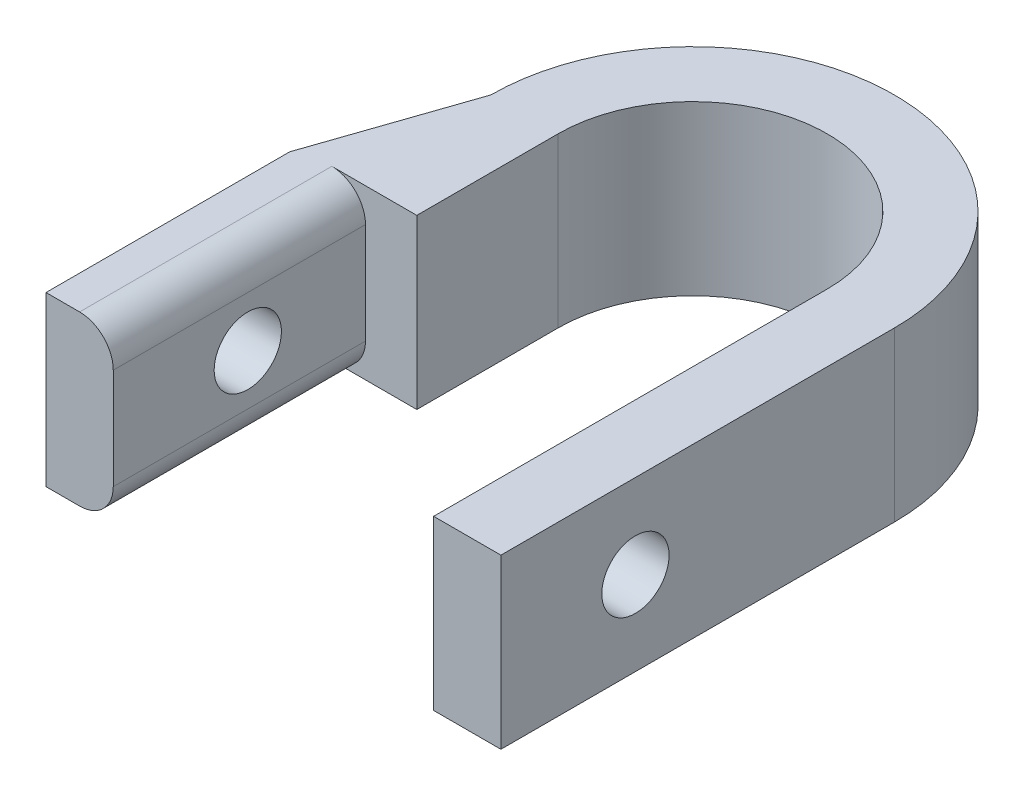
ISO-10303-21;
HEADER;
FILE_DESCRIPTION(('STEP AP214'),'2;1');
FILE_NAME('part.step','',(''),(''),'','','');
FILE_SCHEMA(('AUTOMOTIVE_DESIGN { 1 0 10303 214 1 1 1 1 }'));
ENDSEC;
DATA;
#1=APPLICATION_CONTEXT('core data for automotive mechanical design processes');
#2=APPLICATION_PROTOCOL_DEFINITION('international standard','automotive_design',2000,#1);
#3=PRODUCT_CONTEXT('',#1,'mechanical');
#4=PRODUCT('Part','Part','',(#3));
#5=PRODUCT_RELATED_PRODUCT_CATEGORY('part','',(#4));
#6=PRODUCT_DEFINITION_FORMATION('','',#4);
#7=PRODUCT_DEFINITION_CONTEXT('part definition',#1,'design');
#8=PRODUCT_DEFINITION('design','',#6,#7);
#9=PRODUCT_DEFINITION_SHAPE('','',#8);
#10=(LENGTH_UNIT() NAMED_UNIT(*) SI_UNIT(.MILLI.,.METRE.));
#11=(NAMED_UNIT(*) PLANE_ANGLE_UNIT() SI_UNIT($,.RADIAN.));
#12=(NAMED_UNIT(*) SI_UNIT($,.STERADIAN.) SOLID_ANGLE_UNIT());
#13=UNCERTAINTY_MEASURE_WITH_UNIT(LENGTH_MEASURE(1.E-05),#10,'distance_accuracy_value','');
#14=(GEOMETRIC_REPRESENTATION_CONTEXT(3) GLOBAL_UNCERTAINTY_ASSIGNED_CONTEXT((#13)) GLOBAL_UNIT_ASSIGNED_CONTEXT((#10,
#11,#12)) REPRESENTATION_CONTEXT('',''));
#15=CARTESIAN_POINT('',(0.,0.,0.));
#16=DIRECTION('',(0.,0.,1.));
#17=DIRECTION('',(1.,0.,0.));
#18=AXIS2_PLACEMENT_3D('',#15,#16,#17);
#19=CARTESIAN_POINT('',(-17.5455309593657,15.875,13.3449942704179));
#20=DIRECTION('',(0.,0.,-1.));
#21=DIRECTION('',(-1.,0.,0.));
#22=AXIS2_PLACEMENT_3D('',#19,#20,#21);
#23=PLANE('',#22);
#24=DIRECTION('',(1.,0.,0.));
#25=VECTOR('',#24,1.);
#26=CARTESIAN_POINT('',(-17.5455309593657,0.,13.3449942704179));
#27=LINE('',#26,#25);
#28=CARTESIAN_POINT('',(-20.7205309593657,0.,13.3449942704179));
#29=VERTEX_POINT('',#28);
#30=CARTESIAN_POINT('',(-12.6998630978574,0.,13.3449942704179));
#31=VERTEX_POINT('',#30);
#32=EDGE_CURVE('E32',#29,#31,#27,.T.);
#33=ORIENTED_EDGE('',*,*,#32,.T.);
#34=DIRECTION('',(0.,-1.,0.));
#35=VECTOR('',#34,1.);
#36=CARTESIAN_POINT('',(-12.6998630978574,15.875,13.3449942704179));
#37=LINE('',#36,#35);
#38=CARTESIAN_POINT('',(-12.6998630978574,15.875,13.3449942704179));
#39=VERTEX_POINT('',#38);
#40=EDGE_CURVE('E123',#39,#31,#37,.T.);
#41=ORIENTED_EDGE('',*,*,#40,.F.);
#42=DIRECTION('',(1.,0.,0.));
#43=VECTOR('',#42,1.);
#44=CARTESIAN_POINT('',(-17.5455309593657,15.875,13.3449942704179));
#45=LINE('',#44,#43);
#46=CARTESIAN_POINT('',(-20.7205309593657,15.875,13.3449942704179));
#47=VERTEX_POINT('',#46);
#48=EDGE_CURVE('E109',#47,#39,#45,.T.);
#49=ORIENTED_EDGE('',*,*,#48,.F.);
#50=CARTESIAN_POINT('',(-20.7205309593657,12.7,13.3449942704179));
#51=DIRECTION('',(0.,0.,-1.));
#52=DIRECTION('',(-1.,0.,0.));
#53=AXIS2_PLACEMENT_3D('',#50,#51,#52);
#54=CIRCLE('',#53,3.175);
#55=CARTESIAN_POINT('',(-17.5455309593657,12.7,13.3449942704179));
#56=VERTEX_POINT('',#55);
#57=EDGE_CURVE('E25',#47,#56,#54,.T.);
#58=ORIENTED_EDGE('',*,*,#57,.T.);
#59=DIRECTION('',(0.,-1.,0.));
#60=VECTOR('',#59,1.);
#61=CARTESIAN_POINT('',(-17.5455309593657,15.875,13.3449942704179));
#62=LINE('',#61,#60);
#63=CARTESIAN_POINT('',(-17.5455309593657,3.175,13.3449942704179));
#64=VERTEX_POINT('',#63);
#65=EDGE_CURVE('E125',#56,#64,#62,.T.);
#66=ORIENTED_EDGE('',*,*,#65,.T.);
#67=CARTESIAN_POINT('',(-20.7205309593657,3.175,13.3449942704179));
#68=DIRECTION('',(0.,0.,-1.));
#69=DIRECTION('',(-1.,0.,0.));
#70=AXIS2_PLACEMENT_3D('',#67,#68,#69);
#71=CIRCLE('',#70,3.175);
#72=EDGE_CURVE('E11',#64,#29,#71,.T.);
#73=ORIENTED_EDGE('',*,*,#72,.T.);
#74=EDGE_LOOP('',(#33,#41,#49,#58,#66,#73));
#75=FACE_BOUND('',#74,.T.);
#76=ADVANCED_FACE('F17',(#75),#23,.F.);
#77=CARTESIAN_POINT('',(-12.6998630978574,15.875,13.3449942704179));
#78=DIRECTION('',(-0.99999999994738,0.,1.02586887505242E-05));
#79=DIRECTION('',(1.02586887505242E-05,0.,0.99999999994738));
#80=AXIS2_PLACEMENT_3D('',#77,#78,#79);
#81=PLANE('',#80);
#82=DIRECTION('',(-1.02586887505242E-05,0.,-0.99999999994738));
#83=VECTOR('',#82,1.);
#84=CARTESIAN_POINT('',(-12.6998630978574,0.,13.3449942704179));
#85=LINE('',#84,#83);
#86=CARTESIAN_POINT('',(-12.7,0.,0.));
#87=VERTEX_POINT('',#86);
#88=EDGE_CURVE('E152',#31,#87,#85,.T.);
#89=ORIENTED_EDGE('',*,*,#88,.T.);
#90=DIRECTION('',(0.,-1.,0.));
#91=VECTOR('',#90,1.);
#92=CARTESIAN_POINT('',(-12.7,15.875,0.));
#93=LINE('',#92,#91);
#94=CARTESIAN_POINT('',(-12.7,15.875,0.));
#95=VERTEX_POINT('',#94);
#96=EDGE_CURVE('E126',#95,#87,#93,.T.);
#97=ORIENTED_EDGE('',*,*,#96,.F.);
#98=DIRECTION('',(-1.02586887505242E-05,0.,-0.99999999994738));
#99=VECTOR('',#98,1.);
#100=CARTESIAN_POINT('',(-12.6998630978574,15.875,13.3449942704179));
#101=LINE('',#100,#99);
#102=EDGE_CURVE('E114',#39,#95,#101,.T.);
#103=ORIENTED_EDGE('',*,*,#102,.F.);
#104=ORIENTED_EDGE('',*,*,#40,.T.);
#105=EDGE_LOOP('',(#89,#97,#103,#104));
#106=FACE_BOUND('',#105,.T.);
#107=ADVANCED_FACE('F128',(#106),#81,.F.);
#108=CARTESIAN_POINT('',(0.,15.875,0.));
#109=DIRECTION('',(0.,-1.,0.));
#110=DIRECTION('',(0.,0.,-1.));
#111=AXIS2_PLACEMENT_3D('',#108,#109,#110);
#112=CYLINDRICAL_SURFACE('',#111,12.7);
#113=CARTESIAN_POINT('',(0.,0.,0.));
#114=DIRECTION('',(0.,-1.,0.));
#115=DIRECTION('',(0.,0.,1.));
#116=AXIS2_PLACEMENT_3D('',#113,#114,#115);
#117=CIRCLE('',#116,12.7);
#118=CARTESIAN_POINT('',(12.7,0.,0.));
#119=VERTEX_POINT('',#118);
#120=EDGE_CURVE('E155',#87,#119,#117,.T.);
#121=ORIENTED_EDGE('',*,*,#120,.T.);
#122=DIRECTION('',(0.,-1.,0.));
#123=VECTOR('',#122,1.);
#124=CARTESIAN_POINT('',(12.7,15.875,0.));
#125=LINE('',#124,#123);
#126=CARTESIAN_POINT('',(12.7,15.875,0.));
#127=VERTEX_POINT('',#126);
#128=EDGE_CURVE('E191',#127,#119,#125,.T.);
#129=ORIENTED_EDGE('',*,*,#128,.F.);
#130=CARTESIAN_POINT('',(0.,15.875,0.));
#131=DIRECTION('',(0.,-1.,0.));
#132=DIRECTION('',(0.,0.,1.));
#133=AXIS2_PLACEMENT_3D('',#130,#131,#132);
#134=CIRCLE('',#133,12.7);
#135=EDGE_CURVE('E131',#95,#127,#134,.T.);
#136=ORIENTED_EDGE('',*,*,#135,.F.);
#137=ORIENTED_EDGE('',*,*,#96,.T.);
#138=EDGE_LOOP('',(#121,#129,#136,#137));
#139=FACE_BOUND('',#138,.T.);
#140=ADVANCED_FACE('F246',(#139),#112,.F.);
#141=CARTESIAN_POINT('',(12.7,15.875,0.));
#142=DIRECTION('',(1.,0.,0.));
#143=DIRECTION('',(0.,0.,-1.));
#144=AXIS2_PLACEMENT_3D('',#141,#142,#143);
#145=PLANE('',#144);
#146=CARTESIAN_POINT('',(12.7,7.9375,24.4549942704179));
#147=DIRECTION('',(1.,0.,0.));
#148=DIRECTION('',(0.,0.,-1.));
#149=AXIS2_PLACEMENT_3D('',#146,#147,#148);
#150=CIRCLE('',#149,3.175);
#151=CARTESIAN_POINT('',(12.7,7.9375,21.2799942704179));
#152=VERTEX_POINT('',#151);
#153=EDGE_CURVE('E153',#152,#152,#150,.T.);
#154=ORIENTED_EDGE('',*,*,#153,.T.);
#155=EDGE_LOOP('',(#154));
#156=FACE_BOUND('',#155,.T.);
#157=DIRECTION('',(0.,0.,1.));
#158=VECTOR('',#157,1.);
#159=CARTESIAN_POINT('',(12.7,0.,0.));
#160=LINE('',#159,#158);
#161=CARTESIAN_POINT('',(12.7,0.,37.1549942704179));
#162=VERTEX_POINT('',#161);
#163=EDGE_CURVE('E157',#119,#162,#160,.T.);
#164=ORIENTED_EDGE('',*,*,#163,.T.);
#165=DIRECTION('',(0.,-1.,0.));
#166=VECTOR('',#165,1.);
#167=CARTESIAN_POINT('',(12.7,15.875,37.1549942704179));
#168=LINE('',#167,#166);
#169=CARTESIAN_POINT('',(12.7,15.875,37.1549942704179));
#170=VERTEX_POINT('',#169);
#171=EDGE_CURVE('E188',#170,#162,#168,.T.);
#172=ORIENTED_EDGE('',*,*,#171,.F.);
#173=DIRECTION('',(0.,0.,1.));
#174=VECTOR('',#173,1.);
#175=CARTESIAN_POINT('',(12.7,15.875,0.));
#176=LINE('',#175,#174);
#177=EDGE_CURVE('E133',#127,#170,#176,.T.);
#178=ORIENTED_EDGE('',*,*,#177,.F.);
#179=ORIENTED_EDGE('',*,*,#128,.T.);
#180=EDGE_LOOP('',(#164,#172,#178,#179));
#181=FACE_BOUND('',#180,.T.);
#182=ADVANCED_FACE('F251',(#156,#181),#145,.F.);
#183=CARTESIAN_POINT('',(19.05,15.875,37.1549942704179));
#184=DIRECTION('',(0.,0.,-1.));
#185=DIRECTION('',(-1.,0.,0.));
#186=AXIS2_PLACEMENT_3D('',#183,#184,#185);
#187=PLANE('',#186);
#188=DIRECTION('',(1.,0.,0.));
#189=VECTOR('',#188,1.);
#190=CARTESIAN_POINT('',(19.05,0.,37.1549942704179));
#191=LINE('',#190,#189);
#192=CARTESIAN_POINT('',(19.05,0.,37.1549942704179));
#193=VERTEX_POINT('',#192);
#194=EDGE_CURVE('E159',#162,#193,#191,.T.);
#195=ORIENTED_EDGE('',*,*,#194,.T.);
#196=DIRECTION('',(0.,-1.,0.));
#197=VECTOR('',#196,1.);
#198=CARTESIAN_POINT('',(19.05,15.875,37.1549942704179));
#199=LINE('',#198,#197);
#200=CARTESIAN_POINT('',(19.05,15.875,37.1549942704179));
#201=VERTEX_POINT('',#200);
#202=EDGE_CURVE('E185',#201,#193,#199,.T.);
#203=ORIENTED_EDGE('',*,*,#202,.F.);
#204=DIRECTION('',(1.,0.,0.));
#205=VECTOR('',#204,1.);
#206=CARTESIAN_POINT('',(19.05,15.875,37.1549942704179));
#207=LINE('',#206,#205);
#208=EDGE_CURVE('E138',#170,#201,#207,.T.);
#209=ORIENTED_EDGE('',*,*,#208,.F.);
#210=ORIENTED_EDGE('',*,*,#171,.T.);
#211=EDGE_LOOP('',(#195,#203,#209,#210));
#212=FACE_BOUND('',#211,.T.);
#213=ADVANCED_FACE('F255',(#212),#187,.F.);
#214=CARTESIAN_POINT('',(19.05,15.875,0.));
#215=DIRECTION('',(-1.,0.,0.));
#216=DIRECTION('',(0.,0.,1.));
#217=AXIS2_PLACEMENT_3D('',#214,#215,#216);
#218=PLANE('',#217);
#219=CARTESIAN_POINT('',(19.05,7.9375,24.4549942704179));
#220=DIRECTION('',(-1.,0.,0.));
#221=DIRECTION('',(0.,0.,1.));
#222=AXIS2_PLACEMENT_3D('',#219,#220,#221);
#223=CIRCLE('',#222,3.175);
#224=CARTESIAN_POINT('',(19.05,7.9375,27.6299942704179));
#225=VERTEX_POINT('',#224);
#226=EDGE_CURVE('E200',#225,#225,#223,.T.);
#227=ORIENTED_EDGE('',*,*,#226,.T.);
#228=EDGE_LOOP('',(#227));
#229=FACE_BOUND('',#228,.T.);
#230=DIRECTION('',(0.,0.,-1.));
#231=VECTOR('',#230,1.);
#232=CARTESIAN_POINT('',(19.05,0.,0.));
#233=LINE('',#232,#231);
#234=CARTESIAN_POINT('',(19.05,0.,0.));
#235=VERTEX_POINT('',#234);
#236=EDGE_CURVE('E161',#193,#235,#233,.T.);
#237=ORIENTED_EDGE('',*,*,#236,.T.);
#238=DIRECTION('',(0.,-1.,0.));
#239=VECTOR('',#238,1.);
#240=CARTESIAN_POINT('',(19.05,15.875,0.));
#241=LINE('',#240,#239);
#242=CARTESIAN_POINT('',(19.05,15.875,0.));
#243=VERTEX_POINT('',#242);
#244=EDGE_CURVE('E182',#243,#235,#241,.T.);
#245=ORIENTED_EDGE('',*,*,#244,.F.);
#246=DIRECTION('',(0.,0.,-1.));
#247=VECTOR('',#246,1.);
#248=CARTESIAN_POINT('',(19.05,15.875,0.));
#249=LINE('',#248,#247);
#250=EDGE_CURVE('E140',#201,#243,#249,.T.);
#251=ORIENTED_EDGE('',*,*,#250,.F.);
#252=ORIENTED_EDGE('',*,*,#202,.T.);
#253=EDGE_LOOP('',(#237,#245,#251,#252));
#254=FACE_BOUND('',#253,.T.);
#255=ADVANCED_FACE('F259',(#229,#254),#218,.F.);
#256=CARTESIAN_POINT('',(0.,15.875,0.));
#257=DIRECTION('',(0.,-1.,0.));
#258=DIRECTION('',(0.,0.,-1.));
#259=AXIS2_PLACEMENT_3D('',#256,#257,#258);
#260=CYLINDRICAL_SURFACE('',#259,19.05);
#261=CARTESIAN_POINT('',(0.,0.,0.));
#262=DIRECTION('',(0.,1.,0.));
#263=DIRECTION('',(0.,0.,1.));
#264=AXIS2_PLACEMENT_3D('',#261,#262,#263);
#265=CIRCLE('',#264,19.05);
#266=CARTESIAN_POINT('',(-19.05,0.,0.));
#267=VERTEX_POINT('',#266);
#268=EDGE_CURVE('E163',#235,#267,#265,.T.);
#269=ORIENTED_EDGE('',*,*,#268,.T.);
#270=DIRECTION('',(0.,-1.,0.));
#271=VECTOR('',#270,1.);
#272=CARTESIAN_POINT('',(-19.05,15.875,0.));
#273=LINE('',#272,#271);
#274=CARTESIAN_POINT('',(-19.05,15.875,0.));
#275=VERTEX_POINT('',#274);
#276=EDGE_CURVE('E179',#275,#267,#273,.T.);
#277=ORIENTED_EDGE('',*,*,#276,.F.);
#278=CARTESIAN_POINT('',(0.,15.875,0.));
#279=DIRECTION('',(0.,1.,0.));
#280=DIRECTION('',(0.,0.,1.));
#281=AXIS2_PLACEMENT_3D('',#278,#279,#280);
#282=CIRCLE('',#281,19.05);
#283=EDGE_CURVE('E142',#243,#275,#282,.T.);
#284=ORIENTED_EDGE('',*,*,#283,.F.);
#285=ORIENTED_EDGE('',*,*,#244,.T.);
#286=EDGE_LOOP('',(#269,#277,#284,#285));
#287=FACE_BOUND('',#286,.T.);
#288=ADVANCED_FACE('F263',(#287),#260,.T.);
#289=CARTESIAN_POINT('',(-19.05,15.875,0.));
#290=DIRECTION('',(0.946052568003037,0.,0.324013176545121));
#291=DIRECTION('',(0.324013176545121,0.,-0.946052568003037));
#292=AXIS2_PLACEMENT_3D('',#289,#290,#291);
#293=PLANE('',#292);
#294=DIRECTION('',(-0.324013176545121,0.,0.946052568003037));
#295=VECTOR('',#294,1.);
#296=CARTESIAN_POINT('',(-19.05,0.,0.));
#297=LINE('',#296,#295);
#298=CARTESIAN_POINT('',(-23.8955309593657,0.,14.1479647720678));
#299=VERTEX_POINT('',#298);
#300=EDGE_CURVE('E165',#267,#299,#297,.T.);
#301=ORIENTED_EDGE('',*,*,#300,.T.);
#302=DIRECTION('',(0.,-1.,0.));
#303=VECTOR('',#302,1.);
#304=CARTESIAN_POINT('',(-23.8955309593657,15.875,14.1479647720678));
#305=LINE('',#304,#303);
#306=CARTESIAN_POINT('',(-23.8955309593657,15.875,14.1479647720678));
#307=VERTEX_POINT('',#306);
#308=EDGE_CURVE('E176',#307,#299,#305,.T.);
#309=ORIENTED_EDGE('',*,*,#308,.F.);
#310=DIRECTION('',(-0.324013176545121,0.,0.946052568003037));
#311=VECTOR('',#310,1.);
#312=CARTESIAN_POINT('',(-19.05,15.875,0.));
#313=LINE('',#312,#311);
#314=EDGE_CURVE('E144',#275,#307,#313,.T.);
#315=ORIENTED_EDGE('',*,*,#314,.F.);
#316=ORIENTED_EDGE('',*,*,#276,.T.);
#317=EDGE_LOOP('',(#301,#309,#315,#316));
#318=FACE_BOUND('',#317,.T.);
#319=ADVANCED_FACE('F267',(#318),#293,.F.);
#320=CARTESIAN_POINT('',(-23.8955309593657,15.875,14.1479647720678));
#321=DIRECTION('',(1.,0.,0.));
#322=DIRECTION('',(0.,0.,-1.));
#323=AXIS2_PLACEMENT_3D('',#320,#321,#322);
#324=PLANE('',#323);
#325=CARTESIAN_POINT('',(-23.8955309593657,7.9375,24.4549942704179));
#326=DIRECTION('',(1.,0.,0.));
#327=DIRECTION('',(0.,0.,-1.));
#328=AXIS2_PLACEMENT_3D('',#325,#326,#327);
#329=CIRCLE('',#328,3.175);
#330=CARTESIAN_POINT('',(-23.8955309593657,7.9375,21.2799942704179));
#331=VERTEX_POINT('',#330);
#332=EDGE_CURVE('E201',#331,#331,#329,.T.);
#333=ORIENTED_EDGE('',*,*,#332,.T.);
#334=EDGE_LOOP('',(#333));
#335=FACE_BOUND('',#334,.T.);
#336=DIRECTION('',(0.,0.,1.));
#337=VECTOR('',#336,1.);
#338=CARTESIAN_POINT('',(-23.8955309593657,0.,14.1479647720678));
#339=LINE('',#338,#337);
#340=CARTESIAN_POINT('',(-23.8955309593657,0.,37.1549942704179));
#341=VERTEX_POINT('',#340);
#342=EDGE_CURVE('E167',#299,#341,#339,.T.);
#343=ORIENTED_EDGE('',*,*,#342,.T.);
#344=DIRECTION('',(0.,-1.,0.));
#345=VECTOR('',#344,1.);
#346=CARTESIAN_POINT('',(-23.8955309593657,15.875,37.1549942704179));
#347=LINE('',#346,#345);
#348=CARTESIAN_POINT('',(-23.8955309593657,15.875,37.1549942704179));
#349=VERTEX_POINT('',#348);
#350=EDGE_CURVE('E173',#349,#341,#347,.T.);
#351=ORIENTED_EDGE('',*,*,#350,.F.);
#352=DIRECTION('',(0.,0.,1.));
#353=VECTOR('',#352,1.);
#354=CARTESIAN_POINT('',(-23.8955309593657,15.875,14.1479647720678));
#355=LINE('',#354,#353);
#356=EDGE_CURVE('E146',#307,#349,#355,.T.);
#357=ORIENTED_EDGE('',*,*,#356,.F.);
#358=ORIENTED_EDGE('',*,*,#308,.T.);
#359=EDGE_LOOP('',(#343,#351,#357,#358));
#360=FACE_BOUND('',#359,.T.);
#361=ADVANCED_FACE('F229',(#335,#360),#324,.F.);
#362=CARTESIAN_POINT('',(-17.5455309593657,15.875,37.1549942704179));
#363=DIRECTION('',(0.,0.,-1.));
#364=DIRECTION('',(-1.,0.,0.));
#365=AXIS2_PLACEMENT_3D('',#362,#363,#364);
#366=PLANE('',#365);
#367=DIRECTION('',(0.,-1.,0.));
#368=VECTOR('',#367,1.);
#369=CARTESIAN_POINT('',(-17.5455309593657,15.875,37.1549942704179));
#370=LINE('',#369,#368);
#371=CARTESIAN_POINT('',(-17.5455309593657,12.7,37.1549942704179));
#372=VERTEX_POINT('',#371);
#373=CARTESIAN_POINT('',(-17.5455309593657,3.175,37.1549942704179));
#374=VERTEX_POINT('',#373);
#375=EDGE_CURVE('E150',#372,#374,#370,.T.);
#376=ORIENTED_EDGE('',*,*,#375,.F.);
#377=CARTESIAN_POINT('',(-20.7205309593657,12.7,37.1549942704179));
#378=DIRECTION('',(0.,0.,-1.));
#379=DIRECTION('',(-1.,0.,0.));
#380=AXIS2_PLACEMENT_3D('',#377,#378,#379);
#381=CIRCLE('',#380,3.175);
#382=CARTESIAN_POINT('',(-20.7205309593657,15.875,37.1549942704179));
#383=VERTEX_POINT('',#382);
#384=EDGE_CURVE('E210',#372,#383,#381,.F.);
#385=ORIENTED_EDGE('',*,*,#384,.T.);
#386=DIRECTION('',(1.,0.,0.));
#387=VECTOR('',#386,1.);
#388=CARTESIAN_POINT('',(-23.8955309593657,15.875,37.1549942704179));
#389=LINE('',#388,#387);
#390=EDGE_CURVE('E148',#349,#383,#389,.T.);
#391=ORIENTED_EDGE('',*,*,#390,.F.);
#392=ORIENTED_EDGE('',*,*,#350,.T.);
#393=DIRECTION('',(1.,0.,0.));
#394=VECTOR('',#393,1.);
#395=CARTESIAN_POINT('',(-17.5455309593657,0.,37.1549942704179));
#396=LINE('',#395,#394);
#397=CARTESIAN_POINT('',(-20.7205309593657,0.,37.1549942704179));
#398=VERTEX_POINT('',#397);
#399=EDGE_CURVE('E120',#341,#398,#396,.T.);
#400=ORIENTED_EDGE('',*,*,#399,.T.);
#401=CARTESIAN_POINT('',(-20.7205309593657,3.175,37.1549942704179));
#402=DIRECTION('',(0.,0.,-1.));
#403=DIRECTION('',(-1.,0.,0.));
#404=AXIS2_PLACEMENT_3D('',#401,#402,#403);
#405=CIRCLE('',#404,3.175);
#406=EDGE_CURVE('E208',#398,#374,#405,.F.);
#407=ORIENTED_EDGE('',*,*,#406,.T.);
#408=EDGE_LOOP('',(#376,#385,#391,#392,#400,#407));
#409=FACE_BOUND('',#408,.T.);
#410=ADVANCED_FACE('F223',(#409),#366,.F.);
#411=CARTESIAN_POINT('',(-17.5455309593657,15.875,14.1479647720678));
#412=DIRECTION('',(-1.,0.,0.));
#413=DIRECTION('',(0.,0.,1.));
#414=AXIS2_PLACEMENT_3D('',#411,#412,#413);
#415=PLANE('',#414);
#416=CARTESIAN_POINT('',(-17.5455309593657,7.9375,24.4549942704179));
#417=DIRECTION('',(-1.,0.,0.));
#418=DIRECTION('',(0.,0.,1.));
#419=AXIS2_PLACEMENT_3D('',#416,#417,#418);
#420=CIRCLE('',#419,3.175);
#421=CARTESIAN_POINT('',(-17.5455309593657,7.9375,27.6299942704179));
#422=VERTEX_POINT('',#421);
#423=EDGE_CURVE('E197',#422,#422,#420,.T.);
#424=ORIENTED_EDGE('',*,*,#423,.T.);
#425=EDGE_LOOP('',(#424));
#426=FACE_BOUND('',#425,.T.);
#427=ORIENTED_EDGE('',*,*,#65,.F.);
#428=DIRECTION('',(0.,0.,-1.));
#429=VECTOR('',#428,1.);
#430=CARTESIAN_POINT('',(-17.5455309593657,12.7,37.1549942704179));
#431=LINE('',#430,#429);
#432=EDGE_CURVE('E206',#56,#372,#431,.F.);
#433=ORIENTED_EDGE('',*,*,#432,.T.);
#434=ORIENTED_EDGE('',*,*,#375,.T.);
#435=DIRECTION('',(0.,0.,-1.));
#436=VECTOR('',#435,1.);
#437=CARTESIAN_POINT('',(-17.5455309593657,3.175,14.1479647720678));
#438=LINE('',#437,#436);
#439=EDGE_CURVE('E203',#374,#64,#438,.T.);
#440=ORIENTED_EDGE('',*,*,#439,.T.);
#441=EDGE_LOOP('',(#427,#433,#434,#440));
#442=FACE_BOUND('',#441,.T.);
#443=ADVANCED_FACE('F216',(#426,#442),#415,.F.);
#444=CARTESIAN_POINT('',(0.,15.875,0.));
#445=DIRECTION('',(0.,1.,0.));
#446=DIRECTION('',(0.,0.,1.));
#447=AXIS2_PLACEMENT_3D('',#444,#445,#446);
#448=PLANE('',#447);
#449=ORIENTED_EDGE('',*,*,#390,.T.);
#450=DIRECTION('',(0.,0.,-1.));
#451=VECTOR('',#450,1.);
#452=CARTESIAN_POINT('',(-20.7205309593657,15.875,13.3449942704179));
#453=LINE('',#452,#451);
#454=EDGE_CURVE('E117',#383,#47,#453,.T.);
#455=ORIENTED_EDGE('',*,*,#454,.T.);
#456=ORIENTED_EDGE('',*,*,#48,.T.);
#457=ORIENTED_EDGE('',*,*,#102,.T.);
#458=ORIENTED_EDGE('',*,*,#135,.T.);
#459=ORIENTED_EDGE('',*,*,#177,.T.);
#460=ORIENTED_EDGE('',*,*,#208,.T.);
#461=ORIENTED_EDGE('',*,*,#250,.T.);
#462=ORIENTED_EDGE('',*,*,#283,.T.);
#463=ORIENTED_EDGE('',*,*,#314,.T.);
#464=ORIENTED_EDGE('',*,*,#356,.T.);
#465=EDGE_LOOP('',(#449,#455,#456,#457,#458,#459,#460,#461,#462,#463,#464));
#466=FACE_BOUND('',#465,.T.);
#467=ADVANCED_FACE('F112',(#466),#448,.T.);
#468=CARTESIAN_POINT('',(0.,0.,0.));
#469=DIRECTION('',(0.,1.,0.));
#470=DIRECTION('',(0.,0.,1.));
#471=AXIS2_PLACEMENT_3D('',#468,#469,#470);
#472=PLANE('',#471);
#473=ORIENTED_EDGE('',*,*,#32,.F.);
#474=DIRECTION('',(0.,0.,-1.));
#475=VECTOR('',#474,1.);
#476=CARTESIAN_POINT('',(-20.7205309593657,0.,0.));
#477=LINE('',#476,#475);
#478=EDGE_CURVE('E36',#29,#398,#477,.F.);
#479=ORIENTED_EDGE('',*,*,#478,.T.);
#480=ORIENTED_EDGE('',*,*,#399,.F.);
#481=ORIENTED_EDGE('',*,*,#342,.F.);
#482=ORIENTED_EDGE('',*,*,#300,.F.);
#483=ORIENTED_EDGE('',*,*,#268,.F.);
#484=ORIENTED_EDGE('',*,*,#236,.F.);
#485=ORIENTED_EDGE('',*,*,#194,.F.);
#486=ORIENTED_EDGE('',*,*,#163,.F.);
#487=ORIENTED_EDGE('',*,*,#120,.F.);
#488=ORIENTED_EDGE('',*,*,#88,.F.);
#489=EDGE_LOOP('',(#473,#479,#480,#481,#482,#483,#484,#485,#486,#487,#488));
#490=FACE_BOUND('',#489,.T.);
#491=ADVANCED_FACE('F280',(#490),#472,.F.);
#492=CARTESIAN_POINT('',(-23.8955309593657,7.9375,24.4549942704179));
#493=DIRECTION('',(1.,0.,0.));
#494=DIRECTION('',(0.,0.,-1.));
#495=AXIS2_PLACEMENT_3D('',#492,#493,#494);
#496=CYLINDRICAL_SURFACE('',#495,3.175);
#497=ORIENTED_EDGE('',*,*,#332,.F.);
#498=EDGE_LOOP('',(#497));
#499=FACE_BOUND('',#498,.T.);
#500=ORIENTED_EDGE('',*,*,#423,.F.);
#501=EDGE_LOOP('',(#500));
#502=FACE_BOUND('',#501,.T.);
#503=ADVANCED_FACE('F283',(#499,#502),#496,.F.);
#504=ORIENTED_EDGE('',*,*,#226,.F.);
#505=EDGE_LOOP('',(#504));
#506=FACE_BOUND('',#505,.T.);
#507=ORIENTED_EDGE('',*,*,#153,.F.);
#508=EDGE_LOOP('',(#507));
#509=FACE_BOUND('',#508,.T.);
#510=ADVANCED_FACE('F239',(#506,#509),#496,.F.);
#511=CARTESIAN_POINT('',(-20.7205309593657,12.7,0.));
#512=DIRECTION('',(0.,0.,1.));
#513=DIRECTION('',(1.,0.,0.));
#514=AXIS2_PLACEMENT_3D('',#511,#512,#513);
#515=CYLINDRICAL_SURFACE('',#514,3.175);
#516=ORIENTED_EDGE('',*,*,#384,.F.);
#517=ORIENTED_EDGE('',*,*,#432,.F.);
#518=ORIENTED_EDGE('',*,*,#57,.F.);
#519=ORIENTED_EDGE('',*,*,#454,.F.);
#520=EDGE_LOOP('',(#516,#517,#518,#519));
#521=FACE_BOUND('',#520,.T.);
#522=ADVANCED_FACE('F220',(#521),#515,.T.);
#523=CARTESIAN_POINT('',(-20.7205309593657,3.175,14.1479647720678));
#524=DIRECTION('',(0.,0.,-1.));
#525=DIRECTION('',(-1.,0.,0.));
#526=AXIS2_PLACEMENT_3D('',#523,#524,#525);
#527=CYLINDRICAL_SURFACE('',#526,3.175);
#528=ORIENTED_EDGE('',*,*,#406,.F.);
#529=ORIENTED_EDGE('',*,*,#478,.F.);
#530=ORIENTED_EDGE('',*,*,#72,.F.);
#531=ORIENTED_EDGE('',*,*,#439,.F.);
#532=EDGE_LOOP('',(#528,#529,#530,#531));
#533=FACE_BOUND('',#532,.T.);
#534=ADVANCED_FACE('F19',(#533),#527,.T.);
#535=CLOSED_SHELL('',(#76,#107,#140,#182,#213,#255,#288,#319,#361,#410,#443,#467,#491,#503,#510,
#522,#534));
#536=MANIFOLD_SOLID_BREP('B1',#535);
#537=ADVANCED_BREP_SHAPE_REPRESENTATION('',(#18,#536),#14);
#538=SHAPE_DEFINITION_REPRESENTATION(#9,#537);
ENDSEC;
END-ISO-10303-21;
